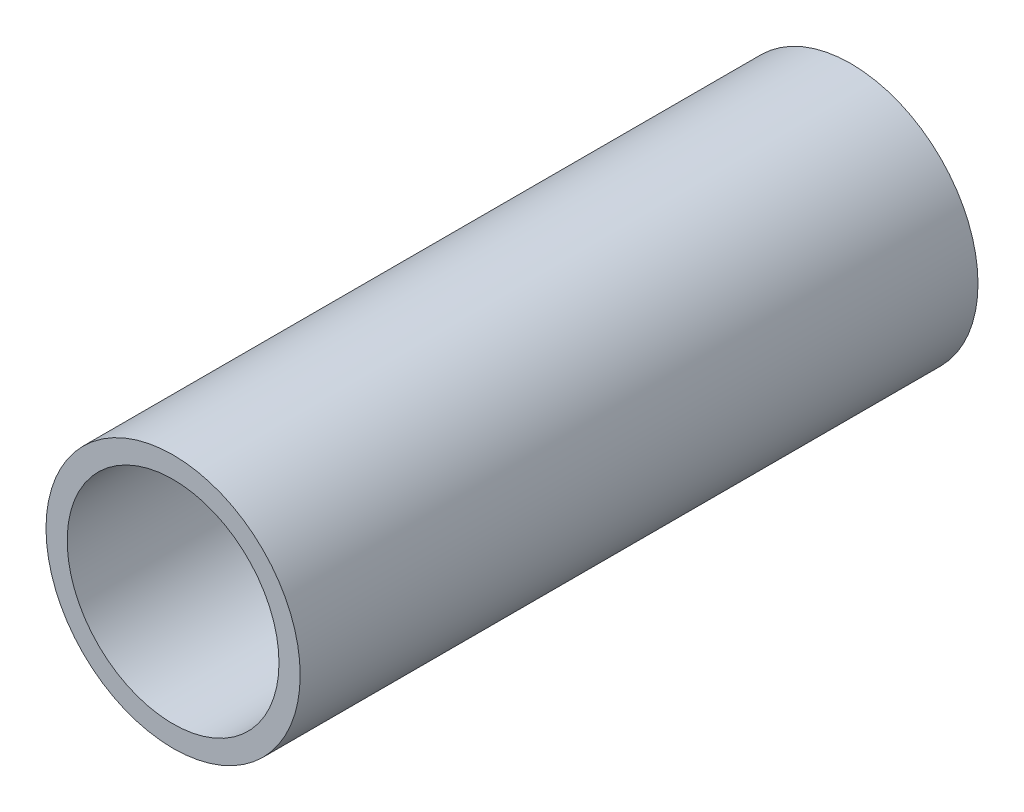
ISO-10303-21;
HEADER;
FILE_DESCRIPTION(('STEP AP214'),'2;1');
FILE_NAME('part.step','',(''),(''),'','','');
FILE_SCHEMA(('AUTOMOTIVE_DESIGN { 1 0 10303 214 1 1 1 1 }'));
ENDSEC;
DATA;
#1=APPLICATION_CONTEXT('core data for automotive mechanical design processes');
#2=APPLICATION_PROTOCOL_DEFINITION('international standard','automotive_design',2000,#1);
#3=PRODUCT_CONTEXT('',#1,'mechanical');
#4=PRODUCT('Part','Part','',(#3));
#5=PRODUCT_RELATED_PRODUCT_CATEGORY('part','',(#4));
#6=PRODUCT_DEFINITION_FORMATION('','',#4);
#7=PRODUCT_DEFINITION_CONTEXT('part definition',#1,'design');
#8=PRODUCT_DEFINITION('design','',#6,#7);
#9=PRODUCT_DEFINITION_SHAPE('','',#8);
#10=(LENGTH_UNIT() NAMED_UNIT(*) SI_UNIT(.MILLI.,.METRE.));
#11=(NAMED_UNIT(*) PLANE_ANGLE_UNIT() SI_UNIT($,.RADIAN.));
#12=(NAMED_UNIT(*) SI_UNIT($,.STERADIAN.) SOLID_ANGLE_UNIT());
#13=UNCERTAINTY_MEASURE_WITH_UNIT(LENGTH_MEASURE(1.E-05),#10,'distance_accuracy_value','');
#14=(GEOMETRIC_REPRESENTATION_CONTEXT(3) GLOBAL_UNCERTAINTY_ASSIGNED_CONTEXT((#13)) GLOBAL_UNIT_ASSIGNED_CONTEXT((#10,
#11,#12)) REPRESENTATION_CONTEXT('',''));
#15=CARTESIAN_POINT('',(0.,0.,0.));
#16=DIRECTION('',(0.,0.,1.));
#17=DIRECTION('',(1.,0.,0.));
#18=AXIS2_PLACEMENT_3D('',#15,#16,#17);
#19=CARTESIAN_POINT('',(0.,0.,203.2));
#20=DIRECTION('',(0.,0.,1.));
#21=DIRECTION('',(1.,0.,0.));
#22=AXIS2_PLACEMENT_3D('',#19,#20,#21);
#23=PLANE('',#22);
#24=CARTESIAN_POINT('',(0.,0.,203.2));
#25=DIRECTION('',(0.,0.,1.));
#26=DIRECTION('',(1.,0.,0.));
#27=AXIS2_PLACEMENT_3D('',#24,#25,#26);
#28=CIRCLE('',#27,38.1);
#29=CARTESIAN_POINT('',(38.1,0.,203.2));
#30=VERTEX_POINT('',#29);
#31=EDGE_CURVE('E13',#30,#30,#28,.T.);
#32=ORIENTED_EDGE('',*,*,#31,.T.);
#33=EDGE_LOOP('',(#32));
#34=FACE_BOUND('',#33,.T.);
#35=CARTESIAN_POINT('',(0.,0.,203.2));
#36=DIRECTION('',(0.,0.,1.));
#37=DIRECTION('',(1.,0.,0.));
#38=AXIS2_PLACEMENT_3D('',#35,#36,#37);
#39=CIRCLE('',#38,31.75);
#40=CARTESIAN_POINT('',(31.75,0.,203.2));
#41=VERTEX_POINT('',#40);
#42=EDGE_CURVE('E59',#41,#41,#39,.T.);
#43=ORIENTED_EDGE('',*,*,#42,.F.);
#44=EDGE_LOOP('',(#43));
#45=FACE_BOUND('',#44,.T.);
#46=ADVANCED_FACE('F48',(#34,#45),#23,.T.);
#47=CARTESIAN_POINT('',(0.,0.,0.));
#48=DIRECTION('',(0.,0.,1.));
#49=DIRECTION('',(1.,0.,0.));
#50=AXIS2_PLACEMENT_3D('',#47,#48,#49);
#51=PLANE('',#50);
#52=CARTESIAN_POINT('',(0.,0.,0.));
#53=DIRECTION('',(0.,0.,1.));
#54=DIRECTION('',(1.,0.,0.));
#55=AXIS2_PLACEMENT_3D('',#52,#53,#54);
#56=CIRCLE('',#55,38.1);
#57=CARTESIAN_POINT('',(38.1,0.,0.));
#58=VERTEX_POINT('',#57);
#59=EDGE_CURVE('E52',#58,#58,#56,.T.);
#60=ORIENTED_EDGE('',*,*,#59,.F.);
#61=EDGE_LOOP('',(#60));
#62=FACE_BOUND('',#61,.T.);
#63=CARTESIAN_POINT('',(0.,0.,0.));
#64=DIRECTION('',(0.,0.,1.));
#65=DIRECTION('',(1.,0.,0.));
#66=AXIS2_PLACEMENT_3D('',#63,#64,#65);
#67=CIRCLE('',#66,31.75);
#68=CARTESIAN_POINT('',(31.75,0.,0.));
#69=VERTEX_POINT('',#68);
#70=EDGE_CURVE('E61',#69,#69,#67,.T.);
#71=ORIENTED_EDGE('',*,*,#70,.T.);
#72=EDGE_LOOP('',(#71));
#73=FACE_BOUND('',#72,.T.);
#74=ADVANCED_FACE('F71',(#62,#73),#51,.F.);
#75=CARTESIAN_POINT('',(0.,0.,203.2));
#76=DIRECTION('',(0.,0.,-1.));
#77=DIRECTION('',(-1.,0.,0.));
#78=AXIS2_PLACEMENT_3D('',#75,#76,#77);
#79=CYLINDRICAL_SURFACE('',#78,38.1);
#80=ORIENTED_EDGE('',*,*,#31,.F.);
#81=EDGE_LOOP('',(#80));
#82=FACE_BOUND('',#81,.T.);
#83=ORIENTED_EDGE('',*,*,#59,.T.);
#84=EDGE_LOOP('',(#83));
#85=FACE_BOUND('',#84,.T.);
#86=ADVANCED_FACE('F50',(#82,#85),#79,.T.);
#87=CARTESIAN_POINT('',(0.,0.,203.2));
#88=DIRECTION('',(0.,0.,-1.));
#89=DIRECTION('',(-1.,0.,0.));
#90=AXIS2_PLACEMENT_3D('',#87,#88,#89);
#91=CYLINDRICAL_SURFACE('',#90,31.75);
#92=ORIENTED_EDGE('',*,*,#42,.T.);
#93=EDGE_LOOP('',(#92));
#94=FACE_BOUND('',#93,.T.);
#95=ORIENTED_EDGE('',*,*,#70,.F.);
#96=EDGE_LOOP('',(#95));
#97=FACE_BOUND('',#96,.T.);
#98=ADVANCED_FACE('F67',(#94,#97),#91,.F.);
#99=CLOSED_SHELL('',(#46,#74,#86,#98));
#100=MANIFOLD_SOLID_BREP('B2',#99);
#101=ADVANCED_BREP_SHAPE_REPRESENTATION('',(#18,#100),#14);
#102=SHAPE_DEFINITION_REPRESENTATION(#9,#101);
ENDSEC;
END-ISO-10303-21;
